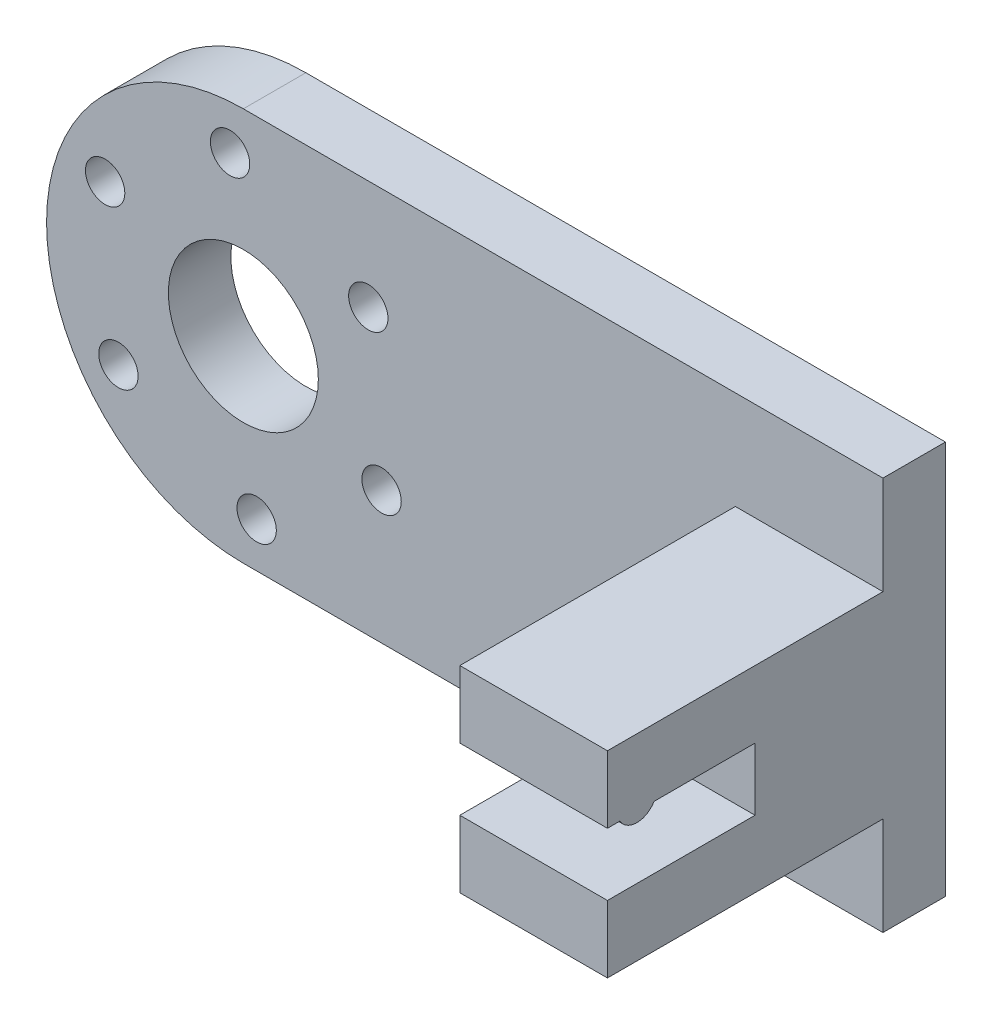
ISO-10303-21;
HEADER;
FILE_DESCRIPTION(('STEP AP214'),'2;1');
FILE_NAME('part.step','',(''),(''),'','','');
FILE_SCHEMA(('AUTOMOTIVE_DESIGN { 1 0 10303 214 1 1 1 1 }'));
ENDSEC;
DATA;
#1=APPLICATION_CONTEXT('core data for automotive mechanical design processes');
#2=APPLICATION_PROTOCOL_DEFINITION('international standard','automotive_design',2000,#1);
#3=PRODUCT_CONTEXT('',#1,'mechanical');
#4=PRODUCT('Part','Part','',(#3));
#5=PRODUCT_RELATED_PRODUCT_CATEGORY('part','',(#4));
#6=PRODUCT_DEFINITION_FORMATION('','',#4);
#7=PRODUCT_DEFINITION_CONTEXT('part definition',#1,'design');
#8=PRODUCT_DEFINITION('design','',#6,#7);
#9=PRODUCT_DEFINITION_SHAPE('','',#8);
#10=(LENGTH_UNIT() NAMED_UNIT(*) SI_UNIT(.MILLI.,.METRE.));
#11=(NAMED_UNIT(*) PLANE_ANGLE_UNIT() SI_UNIT($,.RADIAN.));
#12=(NAMED_UNIT(*) SI_UNIT($,.STERADIAN.) SOLID_ANGLE_UNIT());
#13=UNCERTAINTY_MEASURE_WITH_UNIT(LENGTH_MEASURE(1.E-05),#10,'distance_accuracy_value','');
#14=(GEOMETRIC_REPRESENTATION_CONTEXT(3) GLOBAL_UNCERTAINTY_ASSIGNED_CONTEXT((#13)) GLOBAL_UNIT_ASSIGNED_CONTEXT((#10,
#11,#12)) REPRESENTATION_CONTEXT('',''));
#15=CARTESIAN_POINT('',(0.,0.,0.));
#16=DIRECTION('',(0.,0.,1.));
#17=DIRECTION('',(1.,0.,0.));
#18=AXIS2_PLACEMENT_3D('',#15,#16,#17);
#19=CARTESIAN_POINT('',(-20.001,3.175,34.35));
#20=DIRECTION('',(0.,1.,0.));
#21=DIRECTION('',(0.,0.,1.));
#22=AXIS2_PLACEMENT_3D('',#19,#20,#21);
#23=PLANE('',#22);
#24=DIRECTION('',(0.,0.,-1.));
#25=VECTOR('',#24,1.);
#26=CARTESIAN_POINT('',(50.,3.175,34.35));
#27=LINE('',#26,#25);
#28=CARTESIAN_POINT('',(50.,3.175,34.35));
#29=VERTEX_POINT('',#28);
#30=CARTESIAN_POINT('',(50.,3.175,33.0820508075689));
#31=VERTEX_POINT('',#30);
#32=EDGE_CURVE('E175',#29,#31,#27,.T.);
#33=ORIENTED_EDGE('',*,*,#32,.T.);
#34=DIRECTION('',(1.,0.,0.));
#35=VECTOR('',#34,1.);
#36=CARTESIAN_POINT('',(44.3431457505076,3.175,33.0820508075689));
#37=LINE('',#36,#35);
#38=CARTESIAN_POINT('',(65.,3.175,33.0820508075689));
#39=VERTEX_POINT('',#38);
#40=EDGE_CURVE('E12',#31,#39,#37,.T.);
#41=ORIENTED_EDGE('',*,*,#40,.T.);
#42=DIRECTION('',(0.,0.,1.));
#43=VECTOR('',#42,1.);
#44=CARTESIAN_POINT('',(65.,3.175,34.35));
#45=LINE('',#44,#43);
#46=CARTESIAN_POINT('',(65.,3.175,34.35));
#47=VERTEX_POINT('',#46);
#48=EDGE_CURVE('E221',#39,#47,#45,.T.);
#49=ORIENTED_EDGE('',*,*,#48,.T.);
#50=DIRECTION('',(1.,0.,0.));
#51=VECTOR('',#50,1.);
#52=CARTESIAN_POINT('',(-20.001,3.175,34.35));
#53=LINE('',#52,#51);
#54=EDGE_CURVE('E224',#29,#47,#53,.T.);
#55=ORIENTED_EDGE('',*,*,#54,.F.);
#56=EDGE_LOOP('',(#33,#41,#49,#55));
#57=FACE_BOUND('',#56,.T.);
#58=ADVANCED_FACE('F54',(#57),#23,.F.);
#59=CARTESIAN_POINT('',(0.,0.,0.));
#60=DIRECTION('',(0.,0.,-1.));
#61=DIRECTION('',(-1.,0.,0.));
#62=AXIS2_PLACEMENT_3D('',#59,#60,#61);
#63=PLANE('',#62);
#64=CARTESIAN_POINT('',(45.72,0.,0.));
#65=DIRECTION('',(0.,0.,-1.));
#66=DIRECTION('',(-1.,0.,0.));
#67=AXIS2_PLACEMENT_3D('',#64,#65,#66);
#68=CIRCLE('',#67,3.05);
#69=CARTESIAN_POINT('',(47.3933200530682,2.55,0.));
#70=VERTEX_POINT('',#69);
#71=CARTESIAN_POINT('',(44.0466799469318,2.55,0.));
#72=VERTEX_POINT('',#71);
#73=EDGE_CURVE('E201',#70,#72,#68,.T.);
#74=ORIENTED_EDGE('',*,*,#73,.F.);
#75=DIRECTION('',(1.,0.,0.));
#76=VECTOR('',#75,1.);
#77=CARTESIAN_POINT('',(47.3933200530682,2.55,0.));
#78=LINE('',#77,#76);
#79=EDGE_CURVE('E203',#72,#70,#78,.T.);
#80=ORIENTED_EDGE('',*,*,#79,.F.);
#81=EDGE_LOOP('',(#74,#80));
#82=FACE_BOUND('',#81,.T.);
#83=CARTESIAN_POINT('',(45.72,0.,0.));
#84=DIRECTION('',(0.,0.,-1.));
#85=DIRECTION('',(-1.,0.,0.));
#86=AXIS2_PLACEMENT_3D('',#83,#84,#85);
#87=CIRCLE('',#86,13.5);
#88=CARTESIAN_POINT('',(32.22,0.,0.));
#89=VERTEX_POINT('',#88);
#90=EDGE_CURVE('E183',#89,#89,#87,.T.);
#91=ORIENTED_EDGE('',*,*,#90,.T.);
#92=EDGE_LOOP('',(#91));
#93=FACE_BOUND('',#92,.T.);
#94=ADVANCED_FACE('F378',(#82,#93),#63,.T.);
#95=CARTESIAN_POINT('',(65.,10.,34.35));
#96=DIRECTION('',(0.,0.,-1.));
#97=DIRECTION('',(-1.,0.,0.));
#98=AXIS2_PLACEMENT_3D('',#95,#96,#97);
#99=PLANE('',#98);
#100=DIRECTION('',(0.,-1.,0.));
#101=VECTOR('',#100,1.);
#102=CARTESIAN_POINT('',(50.,10.,34.35));
#103=LINE('',#102,#101);
#104=CARTESIAN_POINT('',(50.,10.,34.35));
#105=VERTEX_POINT('',#104);
#106=EDGE_CURVE('E260',#105,#29,#103,.T.);
#107=ORIENTED_EDGE('',*,*,#106,.T.);
#108=ORIENTED_EDGE('',*,*,#54,.T.);
#109=DIRECTION('',(0.,-1.,0.));
#110=VECTOR('',#109,1.);
#111=CARTESIAN_POINT('',(65.,10.,34.35));
#112=LINE('',#111,#110);
#113=CARTESIAN_POINT('',(65.,10.,34.35));
#114=VERTEX_POINT('',#113);
#115=EDGE_CURVE('E256',#114,#47,#112,.T.);
#116=ORIENTED_EDGE('',*,*,#115,.F.);
#117=DIRECTION('',(1.,0.,0.));
#118=VECTOR('',#117,1.);
#119=CARTESIAN_POINT('',(65.,10.,34.35));
#120=LINE('',#119,#118);
#121=EDGE_CURVE('E244',#105,#114,#120,.T.);
#122=ORIENTED_EDGE('',*,*,#121,.F.);
#123=EDGE_LOOP('',(#107,#108,#116,#122));
#124=FACE_BOUND('',#123,.T.);
#125=ADVANCED_FACE('F376',(#124),#99,.F.);
#126=CARTESIAN_POINT('',(65.,20.,6.35));
#127=DIRECTION('',(1.,0.,0.));
#128=DIRECTION('',(0.,0.,-1.));
#129=AXIS2_PLACEMENT_3D('',#126,#127,#128);
#130=PLANE('',#129);
#131=ORIENTED_EDGE('',*,*,#48,.F.);
#132=CARTESIAN_POINT('',(65.,4.175,31.35));
#133=DIRECTION('',(1.,0.,0.));
#134=DIRECTION('',(0.,0.,-1.));
#135=AXIS2_PLACEMENT_3D('',#132,#133,#134);
#136=CIRCLE('',#135,2.);
#137=CARTESIAN_POINT('',(65.,3.175,29.6179491924311));
#138=VERTEX_POINT('',#137);
#139=EDGE_CURVE('E184',#39,#138,#136,.T.);
#140=ORIENTED_EDGE('',*,*,#139,.T.);
#141=CARTESIAN_POINT('',(65.,3.175,19.35));
#142=VERTEX_POINT('',#141);
#143=EDGE_CURVE('E75',#142,#138,#45,.T.);
#144=ORIENTED_EDGE('',*,*,#143,.F.);
#145=DIRECTION('',(0.,1.,0.));
#146=VECTOR('',#145,1.);
#147=CARTESIAN_POINT('',(65.,3.175,19.35));
#148=LINE('',#147,#146);
#149=CARTESIAN_POINT('',(65.,-3.175,19.35));
#150=VERTEX_POINT('',#149);
#151=EDGE_CURVE('E218',#150,#142,#148,.T.);
#152=ORIENTED_EDGE('',*,*,#151,.F.);
#153=DIRECTION('',(0.,0.,-1.));
#154=VECTOR('',#153,1.);
#155=CARTESIAN_POINT('',(65.,-3.175,34.35));
#156=LINE('',#155,#154);
#157=CARTESIAN_POINT('',(65.,-3.175,34.35));
#158=VERTEX_POINT('',#157);
#159=EDGE_CURVE('E215',#158,#150,#156,.T.);
#160=ORIENTED_EDGE('',*,*,#159,.F.);
#161=CARTESIAN_POINT('',(65.,-10.,34.35));
#162=VERTEX_POINT('',#161);
#163=EDGE_CURVE('E246',#158,#162,#112,.T.);
#164=ORIENTED_EDGE('',*,*,#163,.T.);
#165=DIRECTION('',(0.,0.,-1.));
#166=VECTOR('',#165,1.);
#167=CARTESIAN_POINT('',(65.,-10.,6.35));
#168=LINE('',#167,#166);
#169=CARTESIAN_POINT('',(65.,-10.,6.35));
#170=VERTEX_POINT('',#169);
#171=EDGE_CURVE('E234',#162,#170,#168,.T.);
#172=ORIENTED_EDGE('',*,*,#171,.T.);
#173=DIRECTION('',(0.,-1.,0.));
#174=VECTOR('',#173,1.);
#175=CARTESIAN_POINT('',(65.,20.,6.35));
#176=LINE('',#175,#174);
#177=CARTESIAN_POINT('',(65.,-20.,6.35));
#178=VERTEX_POINT('',#177);
#179=EDGE_CURVE('E312',#170,#178,#176,.T.);
#180=ORIENTED_EDGE('',*,*,#179,.T.);
#181=DIRECTION('',(0.,0.,-1.));
#182=VECTOR('',#181,1.);
#183=CARTESIAN_POINT('',(65.,-20.,6.35));
#184=LINE('',#183,#182);
#185=CARTESIAN_POINT('',(65.,-20.,0.));
#186=VERTEX_POINT('',#185);
#187=EDGE_CURVE('E181',#178,#186,#184,.T.);
#188=ORIENTED_EDGE('',*,*,#187,.T.);
#189=DIRECTION('',(0.,-1.,0.));
#190=VECTOR('',#189,1.);
#191=CARTESIAN_POINT('',(65.,20.,0.));
#192=LINE('',#191,#190);
#193=CARTESIAN_POINT('',(65.,20.,0.));
#194=VERTEX_POINT('',#193);
#195=EDGE_CURVE('E324',#194,#186,#192,.T.);
#196=ORIENTED_EDGE('',*,*,#195,.F.);
#197=DIRECTION('',(0.,0.,-1.));
#198=VECTOR('',#197,1.);
#199=CARTESIAN_POINT('',(65.,20.,6.35));
#200=LINE('',#199,#198);
#201=CARTESIAN_POINT('',(65.,20.,6.35));
#202=VERTEX_POINT('',#201);
#203=EDGE_CURVE('E333',#202,#194,#200,.T.);
#204=ORIENTED_EDGE('',*,*,#203,.F.);
#205=CARTESIAN_POINT('',(65.,10.,6.35));
#206=VERTEX_POINT('',#205);
#207=EDGE_CURVE('E314',#202,#206,#176,.T.);
#208=ORIENTED_EDGE('',*,*,#207,.T.);
#209=DIRECTION('',(0.,0.,-1.));
#210=VECTOR('',#209,1.);
#211=CARTESIAN_POINT('',(65.,10.,6.35));
#212=LINE('',#211,#210);
#213=EDGE_CURVE('E235',#114,#206,#212,.T.);
#214=ORIENTED_EDGE('',*,*,#213,.F.);
#215=ORIENTED_EDGE('',*,*,#115,.T.);
#216=EDGE_LOOP('',(#131,#140,#144,#152,#160,#164,#172,#180,#188,#196,#204,#208,#214,#215));
#217=FACE_BOUND('',#216,.T.);
#218=ADVANCED_FACE('F359',(#217),#130,.T.);
#219=CARTESIAN_POINT('',(0.,20.,6.35));
#220=DIRECTION('',(0.,1.,0.));
#221=DIRECTION('',(0.,0.,1.));
#222=AXIS2_PLACEMENT_3D('',#219,#220,#221);
#223=PLANE('',#222);
#224=DIRECTION('',(1.,0.,0.));
#225=VECTOR('',#224,1.);
#226=CARTESIAN_POINT('',(0.,20.,0.));
#227=LINE('',#226,#225);
#228=CARTESIAN_POINT('',(0.,20.,0.));
#229=VERTEX_POINT('',#228);
#230=EDGE_CURVE('E313',#229,#194,#227,.T.);
#231=ORIENTED_EDGE('',*,*,#230,.F.);
#232=DIRECTION('',(0.,0.,-1.));
#233=VECTOR('',#232,1.);
#234=CARTESIAN_POINT('',(0.,20.,6.35));
#235=LINE('',#234,#233);
#236=CARTESIAN_POINT('',(0.,20.,6.35));
#237=VERTEX_POINT('',#236);
#238=EDGE_CURVE('E331',#237,#229,#235,.T.);
#239=ORIENTED_EDGE('',*,*,#238,.F.);
#240=DIRECTION('',(1.,0.,0.));
#241=VECTOR('',#240,1.);
#242=CARTESIAN_POINT('',(0.,20.,6.35));
#243=LINE('',#242,#241);
#244=EDGE_CURVE('E317',#237,#202,#243,.T.);
#245=ORIENTED_EDGE('',*,*,#244,.T.);
#246=ORIENTED_EDGE('',*,*,#203,.T.);
#247=EDGE_LOOP('',(#231,#239,#245,#246));
#248=FACE_BOUND('',#247,.T.);
#249=ADVANCED_FACE('F357',(#248),#223,.T.);
#250=CARTESIAN_POINT('',(0.,-20.,6.35));
#251=DIRECTION('',(0.,1.,0.));
#252=DIRECTION('',(0.,0.,1.));
#253=AXIS2_PLACEMENT_3D('',#250,#251,#252);
#254=PLANE('',#253);
#255=DIRECTION('',(1.,0.,0.));
#256=VECTOR('',#255,1.);
#257=CARTESIAN_POINT('',(0.,-20.,0.));
#258=LINE('',#257,#256);
#259=CARTESIAN_POINT('',(0.,-20.,0.));
#260=VERTEX_POINT('',#259);
#261=EDGE_CURVE('E321',#260,#186,#258,.T.);
#262=ORIENTED_EDGE('',*,*,#261,.T.);
#263=ORIENTED_EDGE('',*,*,#187,.F.);
#264=DIRECTION('',(1.,0.,0.));
#265=VECTOR('',#264,1.);
#266=CARTESIAN_POINT('',(0.,-20.,6.35));
#267=LINE('',#266,#265);
#268=CARTESIAN_POINT('',(0.,-20.,6.35));
#269=VERTEX_POINT('',#268);
#270=EDGE_CURVE('E309',#269,#178,#267,.T.);
#271=ORIENTED_EDGE('',*,*,#270,.F.);
#272=DIRECTION('',(0.,0.,-1.));
#273=VECTOR('',#272,1.);
#274=CARTESIAN_POINT('',(0.,-20.,6.35));
#275=LINE('',#274,#273);
#276=EDGE_CURVE('E320',#269,#260,#275,.T.);
#277=ORIENTED_EDGE('',*,*,#276,.T.);
#278=EDGE_LOOP('',(#262,#263,#271,#277));
#279=FACE_BOUND('',#278,.T.);
#280=ADVANCED_FACE('F349',(#279),#254,.F.);
#281=CARTESIAN_POINT('',(45.72,0.,0.));
#282=DIRECTION('',(0.,0.,-1.));
#283=DIRECTION('',(-1.,0.,0.));
#284=AXIS2_PLACEMENT_3D('',#281,#282,#283);
#285=CIRCLE('',#284,17.5);
#286=CARTESIAN_POINT('',(28.22,0.,0.));
#287=VERTEX_POINT('',#286);
#288=EDGE_CURVE('E192',#287,#287,#285,.T.);
#289=ORIENTED_EDGE('',*,*,#288,.F.);
#290=EDGE_LOOP('',(#289));
#291=FACE_BOUND('',#290,.T.);
#292=CARTESIAN_POINT('',(-14.0477706990681,6.55058305698084,0.));
#293=DIRECTION('',(0.,0.,1.));
#294=DIRECTION('',(1.,0.,0.));
#295=AXIS2_PLACEMENT_3D('',#292,#293,#294);
#296=CIRCLE('',#295,2.);
#297=CARTESIAN_POINT('',(-12.0477706990681,6.55058305698084,0.));
#298=VERTEX_POINT('',#297);
#299=EDGE_CURVE('E266',#298,#298,#296,.T.);
#300=ORIENTED_EDGE('',*,*,#299,.T.);
#301=EDGE_LOOP('',(#300));
#302=FACE_BOUND('',#301,.T.);
#303=CARTESIAN_POINT('',(-12.6968566864794,-8.89043476344122,0.));
#304=DIRECTION('',(0.,0.,1.));
#305=DIRECTION('',(1.,0.,0.));
#306=AXIS2_PLACEMENT_3D('',#303,#304,#305);
#307=CIRCLE('',#306,2.);
#308=CARTESIAN_POINT('',(-10.6968566864794,-8.89043476344122,0.));
#309=VERTEX_POINT('',#308);
#310=EDGE_CURVE('E295',#309,#309,#307,.T.);
#311=ORIENTED_EDGE('',*,*,#310,.T.);
#312=EDGE_LOOP('',(#311));
#313=FACE_BOUND('',#312,.T.);
#314=CARTESIAN_POINT('',(1.35091401258871,-15.4410178204221,0.));
#315=DIRECTION('',(0.,0.,1.));
#316=DIRECTION('',(1.,0.,0.));
#317=AXIS2_PLACEMENT_3D('',#314,#315,#316);
#318=CIRCLE('',#317,2.);
#319=CARTESIAN_POINT('',(3.35091401258871,-15.4410178204221,0.));
#320=VERTEX_POINT('',#319);
#321=EDGE_CURVE('E289',#320,#320,#318,.T.);
#322=ORIENTED_EDGE('',*,*,#321,.T.);
#323=EDGE_LOOP('',(#322));
#324=FACE_BOUND('',#323,.T.);
#325=CARTESIAN_POINT('',(14.0477706990681,-6.55058305698084,0.));
#326=DIRECTION('',(0.,0.,1.));
#327=DIRECTION('',(1.,0.,0.));
#328=AXIS2_PLACEMENT_3D('',#325,#326,#327);
#329=CIRCLE('',#328,2.);
#330=CARTESIAN_POINT('',(16.0477706990681,-6.55058305698084,0.));
#331=VERTEX_POINT('',#330);
#332=EDGE_CURVE('E283',#331,#331,#329,.T.);
#333=ORIENTED_EDGE('',*,*,#332,.T.);
#334=EDGE_LOOP('',(#333));
#335=FACE_BOUND('',#334,.T.);
#336=CARTESIAN_POINT('',(12.6968566864794,8.89043476344122,0.));
#337=DIRECTION('',(0.,0.,1.));
#338=DIRECTION('',(1.,0.,0.));
#339=AXIS2_PLACEMENT_3D('',#336,#337,#338);
#340=CIRCLE('',#339,2.);
#341=CARTESIAN_POINT('',(14.6968566864794,8.89043476344122,0.));
#342=VERTEX_POINT('',#341);
#343=EDGE_CURVE('E277',#342,#342,#340,.T.);
#344=ORIENTED_EDGE('',*,*,#343,.T.);
#345=EDGE_LOOP('',(#344));
#346=FACE_BOUND('',#345,.T.);
#347=CARTESIAN_POINT('',(-1.3509140125887,15.4410178204221,0.));
#348=DIRECTION('',(0.,0.,1.));
#349=DIRECTION('',(1.,0.,0.));
#350=AXIS2_PLACEMENT_3D('',#347,#348,#349);
#351=CIRCLE('',#350,2.);
#352=CARTESIAN_POINT('',(0.649085987411296,15.4410178204221,0.));
#353=VERTEX_POINT('',#352);
#354=EDGE_CURVE('E271',#353,#353,#351,.T.);
#355=ORIENTED_EDGE('',*,*,#354,.T.);
#356=EDGE_LOOP('',(#355));
#357=FACE_BOUND('',#356,.T.);
#358=CARTESIAN_POINT('',(0.,0.,0.));
#359=DIRECTION('',(0.,0.,1.));
#360=DIRECTION('',(1.,0.,0.));
#361=AXIS2_PLACEMENT_3D('',#358,#359,#360);
#362=CIRCLE('',#361,7.62);
#363=CARTESIAN_POINT('',(7.62,0.,0.));
#364=VERTEX_POINT('',#363);
#365=EDGE_CURVE('E303',#364,#364,#362,.T.);
#366=ORIENTED_EDGE('',*,*,#365,.T.);
#367=EDGE_LOOP('',(#366));
#368=FACE_BOUND('',#367,.T.);
#369=ORIENTED_EDGE('',*,*,#261,.F.);
#370=CARTESIAN_POINT('',(0.,0.,0.));
#371=DIRECTION('',(0.,0.,1.));
#372=DIRECTION('',(1.,0.,0.));
#373=AXIS2_PLACEMENT_3D('',#370,#371,#372);
#374=CIRCLE('',#373,20.);
#375=EDGE_CURVE('E306',#229,#260,#374,.T.);
#376=ORIENTED_EDGE('',*,*,#375,.F.);
#377=ORIENTED_EDGE('',*,*,#230,.T.);
#378=ORIENTED_EDGE('',*,*,#195,.T.);
#379=EDGE_LOOP('',(#369,#376,#377,#378));
#380=FACE_BOUND('',#379,.T.);
#381=ADVANCED_FACE('F345',(#291,#302,#313,#324,#335,#346,#357,#368,#380),#63,.T.);
#382=CARTESIAN_POINT('',(0.,0.,6.35));
#383=DIRECTION('',(0.,0.,-1.));
#384=DIRECTION('',(-1.,0.,0.));
#385=AXIS2_PLACEMENT_3D('',#382,#383,#384);
#386=PLANE('',#385);
#387=DIRECTION('',(-1.,0.,0.));
#388=VECTOR('',#387,1.);
#389=CARTESIAN_POINT('',(47.3933200530682,2.55,6.35));
#390=LINE('',#389,#388);
#391=CARTESIAN_POINT('',(47.3933200530682,2.55,6.35));
#392=VERTEX_POINT('',#391);
#393=CARTESIAN_POINT('',(44.0466799469318,2.55,6.35));
#394=VERTEX_POINT('',#393);
#395=EDGE_CURVE('E209',#392,#394,#390,.T.);
#396=ORIENTED_EDGE('',*,*,#395,.F.);
#397=CARTESIAN_POINT('',(45.72,0.,6.35));
#398=DIRECTION('',(0.,0.,-1.));
#399=DIRECTION('',(-1.,0.,0.));
#400=AXIS2_PLACEMENT_3D('',#397,#398,#399);
#401=CIRCLE('',#400,3.05);
#402=EDGE_CURVE('E197',#394,#392,#401,.F.);
#403=ORIENTED_EDGE('',*,*,#402,.F.);
#404=EDGE_LOOP('',(#396,#403));
#405=FACE_BOUND('',#404,.T.);
#406=CARTESIAN_POINT('',(-14.0477706990681,6.55058305698084,6.35));
#407=DIRECTION('',(0.,0.,1.));
#408=DIRECTION('',(1.,0.,0.));
#409=AXIS2_PLACEMENT_3D('',#406,#407,#408);
#410=CIRCLE('',#409,2.);
#411=CARTESIAN_POINT('',(-12.0477706990681,6.55058305698084,6.35));
#412=VERTEX_POINT('',#411);
#413=EDGE_CURVE('E298',#412,#412,#410,.T.);
#414=ORIENTED_EDGE('',*,*,#413,.F.);
#415=EDGE_LOOP('',(#414));
#416=FACE_BOUND('',#415,.T.);
#417=CARTESIAN_POINT('',(-12.6968566864794,-8.89043476344122,6.35));
#418=DIRECTION('',(0.,0.,1.));
#419=DIRECTION('',(1.,0.,0.));
#420=AXIS2_PLACEMENT_3D('',#417,#418,#419);
#421=CIRCLE('',#420,2.);
#422=CARTESIAN_POINT('',(-10.6968566864794,-8.89043476344122,6.35));
#423=VERTEX_POINT('',#422);
#424=EDGE_CURVE('E292',#423,#423,#421,.T.);
#425=ORIENTED_EDGE('',*,*,#424,.F.);
#426=EDGE_LOOP('',(#425));
#427=FACE_BOUND('',#426,.T.);
#428=CARTESIAN_POINT('',(1.35091401258871,-15.4410178204221,6.35));
#429=DIRECTION('',(0.,0.,1.));
#430=DIRECTION('',(1.,0.,0.));
#431=AXIS2_PLACEMENT_3D('',#428,#429,#430);
#432=CIRCLE('',#431,2.);
#433=CARTESIAN_POINT('',(3.35091401258871,-15.4410178204221,6.35));
#434=VERTEX_POINT('',#433);
#435=EDGE_CURVE('E286',#434,#434,#432,.T.);
#436=ORIENTED_EDGE('',*,*,#435,.F.);
#437=EDGE_LOOP('',(#436));
#438=FACE_BOUND('',#437,.T.);
#439=CARTESIAN_POINT('',(14.0477706990681,-6.55058305698084,6.35));
#440=DIRECTION('',(0.,0.,1.));
#441=DIRECTION('',(1.,0.,0.));
#442=AXIS2_PLACEMENT_3D('',#439,#440,#441);
#443=CIRCLE('',#442,2.);
#444=CARTESIAN_POINT('',(16.0477706990681,-6.55058305698084,6.35));
#445=VERTEX_POINT('',#444);
#446=EDGE_CURVE('E280',#445,#445,#443,.T.);
#447=ORIENTED_EDGE('',*,*,#446,.F.);
#448=EDGE_LOOP('',(#447));
#449=FACE_BOUND('',#448,.T.);
#450=CARTESIAN_POINT('',(12.6968566864794,8.89043476344122,6.35));
#451=DIRECTION('',(0.,0.,1.));
#452=DIRECTION('',(1.,0.,0.));
#453=AXIS2_PLACEMENT_3D('',#450,#451,#452);
#454=CIRCLE('',#453,2.);
#455=CARTESIAN_POINT('',(14.6968566864794,8.89043476344122,6.35));
#456=VERTEX_POINT('',#455);
#457=EDGE_CURVE('E274',#456,#456,#454,.T.);
#458=ORIENTED_EDGE('',*,*,#457,.F.);
#459=EDGE_LOOP('',(#458));
#460=FACE_BOUND('',#459,.T.);
#461=CARTESIAN_POINT('',(-1.3509140125887,15.4410178204221,6.35));
#462=DIRECTION('',(0.,0.,1.));
#463=DIRECTION('',(1.,0.,0.));
#464=AXIS2_PLACEMENT_3D('',#461,#462,#463);
#465=CIRCLE('',#464,2.);
#466=CARTESIAN_POINT('',(0.649085987411296,15.4410178204221,6.35));
#467=VERTEX_POINT('',#466);
#468=EDGE_CURVE('E267',#467,#467,#465,.T.);
#469=ORIENTED_EDGE('',*,*,#468,.F.);
#470=EDGE_LOOP('',(#469));
#471=FACE_BOUND('',#470,.T.);
#472=CARTESIAN_POINT('',(0.,0.,6.35));
#473=DIRECTION('',(0.,0.,1.));
#474=DIRECTION('',(1.,0.,0.));
#475=AXIS2_PLACEMENT_3D('',#472,#473,#474);
#476=CIRCLE('',#475,7.62);
#477=CARTESIAN_POINT('',(7.62,0.,6.35));
#478=VERTEX_POINT('',#477);
#479=EDGE_CURVE('E270',#478,#478,#476,.T.);
#480=ORIENTED_EDGE('',*,*,#479,.F.);
#481=EDGE_LOOP('',(#480));
#482=FACE_BOUND('',#481,.T.);
#483=ORIENTED_EDGE('',*,*,#179,.F.);
#484=DIRECTION('',(-1.,0.,0.));
#485=VECTOR('',#484,1.);
#486=CARTESIAN_POINT('',(65.,-10.,6.35));
#487=LINE('',#486,#485);
#488=CARTESIAN_POINT('',(50.,-10.,6.35));
#489=VERTEX_POINT('',#488);
#490=EDGE_CURVE('E249',#170,#489,#487,.T.);
#491=ORIENTED_EDGE('',*,*,#490,.T.);
#492=DIRECTION('',(0.,-1.,0.));
#493=VECTOR('',#492,1.);
#494=CARTESIAN_POINT('',(50.,10.,6.35));
#495=LINE('',#494,#493);
#496=CARTESIAN_POINT('',(50.,10.,6.35));
#497=VERTEX_POINT('',#496);
#498=EDGE_CURVE('E263',#497,#489,#495,.T.);
#499=ORIENTED_EDGE('',*,*,#498,.F.);
#500=DIRECTION('',(-1.,0.,0.));
#501=VECTOR('',#500,1.);
#502=CARTESIAN_POINT('',(65.,10.,6.35));
#503=LINE('',#502,#501);
#504=EDGE_CURVE('E238',#206,#497,#503,.T.);
#505=ORIENTED_EDGE('',*,*,#504,.F.);
#506=ORIENTED_EDGE('',*,*,#207,.F.);
#507=ORIENTED_EDGE('',*,*,#244,.F.);
#508=CARTESIAN_POINT('',(0.,0.,6.35));
#509=DIRECTION('',(0.,0.,1.));
#510=DIRECTION('',(1.,0.,0.));
#511=AXIS2_PLACEMENT_3D('',#508,#509,#510);
#512=CIRCLE('',#511,20.);
#513=EDGE_CURVE('E325',#237,#269,#512,.T.);
#514=ORIENTED_EDGE('',*,*,#513,.T.);
#515=ORIENTED_EDGE('',*,*,#270,.T.);
#516=EDGE_LOOP('',(#483,#491,#499,#505,#506,#507,#514,#515));
#517=FACE_BOUND('',#516,.T.);
#518=ADVANCED_FACE('F352',(#405,#416,#427,#438,#449,#460,#471,#482,#517),#386,.F.);
#519=CARTESIAN_POINT('',(0.,0.,6.35));
#520=DIRECTION('',(0.,0.,-1.));
#521=DIRECTION('',(-1.,0.,0.));
#522=AXIS2_PLACEMENT_3D('',#519,#520,#521);
#523=CYLINDRICAL_SURFACE('',#522,20.);
#524=ORIENTED_EDGE('',*,*,#375,.T.);
#525=ORIENTED_EDGE('',*,*,#276,.F.);
#526=ORIENTED_EDGE('',*,*,#513,.F.);
#527=ORIENTED_EDGE('',*,*,#238,.T.);
#528=EDGE_LOOP('',(#524,#525,#526,#527));
#529=FACE_BOUND('',#528,.T.);
#530=ADVANCED_FACE('F56',(#529),#523,.T.);
#531=CARTESIAN_POINT('',(0.,0.,0.));
#532=DIRECTION('',(0.,0.,1.));
#533=DIRECTION('',(1.,0.,0.));
#534=AXIS2_PLACEMENT_3D('',#531,#532,#533);
#535=CYLINDRICAL_SURFACE('',#534,7.62);
#536=ORIENTED_EDGE('',*,*,#365,.F.);
#537=EDGE_LOOP('',(#536));
#538=FACE_BOUND('',#537,.T.);
#539=ORIENTED_EDGE('',*,*,#479,.T.);
#540=EDGE_LOOP('',(#539));
#541=FACE_BOUND('',#540,.T.);
#542=ADVANCED_FACE('F417',(#538,#541),#535,.F.);
#543=CARTESIAN_POINT('',(-1.3509140125887,15.4410178204221,0.));
#544=DIRECTION('',(0.,0.,1.));
#545=DIRECTION('',(1.,0.,0.));
#546=AXIS2_PLACEMENT_3D('',#543,#544,#545);
#547=CYLINDRICAL_SURFACE('',#546,2.);
#548=ORIENTED_EDGE('',*,*,#354,.F.);
#549=EDGE_LOOP('',(#548));
#550=FACE_BOUND('',#549,.T.);
#551=ORIENTED_EDGE('',*,*,#468,.T.);
#552=EDGE_LOOP('',(#551));
#553=FACE_BOUND('',#552,.T.);
#554=ADVANCED_FACE('F413',(#550,#553),#547,.F.);
#555=CARTESIAN_POINT('',(12.6968566864794,8.89043476344122,0.));
#556=DIRECTION('',(0.,0.,1.));
#557=DIRECTION('',(1.,0.,0.));
#558=AXIS2_PLACEMENT_3D('',#555,#556,#557);
#559=CYLINDRICAL_SURFACE('',#558,2.);
#560=ORIENTED_EDGE('',*,*,#343,.F.);
#561=EDGE_LOOP('',(#560));
#562=FACE_BOUND('',#561,.T.);
#563=ORIENTED_EDGE('',*,*,#457,.T.);
#564=EDGE_LOOP('',(#563));
#565=FACE_BOUND('',#564,.T.);
#566=ADVANCED_FACE('F416',(#562,#565),#559,.F.);
#567=CARTESIAN_POINT('',(14.0477706990681,-6.55058305698084,0.));
#568=DIRECTION('',(0.,0.,1.));
#569=DIRECTION('',(1.,0.,0.));
#570=AXIS2_PLACEMENT_3D('',#567,#568,#569);
#571=CYLINDRICAL_SURFACE('',#570,2.);
#572=ORIENTED_EDGE('',*,*,#332,.F.);
#573=EDGE_LOOP('',(#572));
#574=FACE_BOUND('',#573,.T.);
#575=ORIENTED_EDGE('',*,*,#446,.T.);
#576=EDGE_LOOP('',(#575));
#577=FACE_BOUND('',#576,.T.);
#578=ADVANCED_FACE('F421',(#574,#577),#571,.F.);
#579=CARTESIAN_POINT('',(1.35091401258871,-15.4410178204221,0.));
#580=DIRECTION('',(0.,0.,1.));
#581=DIRECTION('',(1.,0.,0.));
#582=AXIS2_PLACEMENT_3D('',#579,#580,#581);
#583=CYLINDRICAL_SURFACE('',#582,2.);
#584=ORIENTED_EDGE('',*,*,#321,.F.);
#585=EDGE_LOOP('',(#584));
#586=FACE_BOUND('',#585,.T.);
#587=ORIENTED_EDGE('',*,*,#435,.T.);
#588=EDGE_LOOP('',(#587));
#589=FACE_BOUND('',#588,.T.);
#590=ADVANCED_FACE('F425',(#586,#589),#583,.F.);
#591=CARTESIAN_POINT('',(-12.6968566864794,-8.89043476344122,0.));
#592=DIRECTION('',(0.,0.,1.));
#593=DIRECTION('',(1.,0.,0.));
#594=AXIS2_PLACEMENT_3D('',#591,#592,#593);
#595=CYLINDRICAL_SURFACE('',#594,2.);
#596=ORIENTED_EDGE('',*,*,#310,.F.);
#597=EDGE_LOOP('',(#596));
#598=FACE_BOUND('',#597,.T.);
#599=ORIENTED_EDGE('',*,*,#424,.T.);
#600=EDGE_LOOP('',(#599));
#601=FACE_BOUND('',#600,.T.);
#602=ADVANCED_FACE('F429',(#598,#601),#595,.F.);
#603=CARTESIAN_POINT('',(-14.0477706990681,6.55058305698084,0.));
#604=DIRECTION('',(0.,0.,1.));
#605=DIRECTION('',(1.,0.,0.));
#606=AXIS2_PLACEMENT_3D('',#603,#604,#605);
#607=CYLINDRICAL_SURFACE('',#606,2.);
#608=ORIENTED_EDGE('',*,*,#299,.F.);
#609=EDGE_LOOP('',(#608));
#610=FACE_BOUND('',#609,.T.);
#611=ORIENTED_EDGE('',*,*,#413,.T.);
#612=EDGE_LOOP('',(#611));
#613=FACE_BOUND('',#612,.T.);
#614=ADVANCED_FACE('F412',(#610,#613),#607,.F.);
#615=CARTESIAN_POINT('',(50.,10.,6.35));
#616=DIRECTION('',(1.,0.,0.));
#617=DIRECTION('',(0.,0.,-1.));
#618=AXIS2_PLACEMENT_3D('',#615,#616,#617);
#619=PLANE('',#618);
#620=CARTESIAN_POINT('',(50.,3.175,29.6179491924311));
#621=VERTEX_POINT('',#620);
#622=CARTESIAN_POINT('',(50.,3.175,19.35));
#623=VERTEX_POINT('',#622);
#624=EDGE_CURVE('E166',#621,#623,#27,.T.);
#625=ORIENTED_EDGE('',*,*,#624,.F.);
#626=CARTESIAN_POINT('',(50.,4.175,31.35));
#627=DIRECTION('',(1.,0.,0.));
#628=DIRECTION('',(0.,0.,-1.));
#629=AXIS2_PLACEMENT_3D('',#626,#627,#628);
#630=CIRCLE('',#629,2.);
#631=EDGE_CURVE('E170',#621,#31,#630,.F.);
#632=ORIENTED_EDGE('',*,*,#631,.T.);
#633=ORIENTED_EDGE('',*,*,#32,.F.);
#634=ORIENTED_EDGE('',*,*,#106,.F.);
#635=DIRECTION('',(0.,0.,1.));
#636=VECTOR('',#635,1.);
#637=CARTESIAN_POINT('',(50.,10.,6.35));
#638=LINE('',#637,#636);
#639=EDGE_CURVE('E242',#497,#105,#638,.T.);
#640=ORIENTED_EDGE('',*,*,#639,.F.);
#641=ORIENTED_EDGE('',*,*,#498,.T.);
#642=DIRECTION('',(0.,0.,1.));
#643=VECTOR('',#642,1.);
#644=CARTESIAN_POINT('',(50.,-10.,6.35));
#645=LINE('',#644,#643);
#646=CARTESIAN_POINT('',(50.,-10.,34.35));
#647=VERTEX_POINT('',#646);
#648=EDGE_CURVE('E251',#489,#647,#645,.T.);
#649=ORIENTED_EDGE('',*,*,#648,.T.);
#650=CARTESIAN_POINT('',(50.,-3.175,34.35));
#651=VERTEX_POINT('',#650);
#652=EDGE_CURVE('E259',#651,#647,#103,.T.);
#653=ORIENTED_EDGE('',*,*,#652,.F.);
#654=DIRECTION('',(0.,0.,1.));
#655=VECTOR('',#654,1.);
#656=CARTESIAN_POINT('',(50.,-3.175,34.35));
#657=LINE('',#656,#655);
#658=CARTESIAN_POINT('',(50.,-3.175,19.35));
#659=VERTEX_POINT('',#658);
#660=EDGE_CURVE('E227',#659,#651,#657,.T.);
#661=ORIENTED_EDGE('',*,*,#660,.F.);
#662=DIRECTION('',(0.,-1.,0.));
#663=VECTOR('',#662,1.);
#664=CARTESIAN_POINT('',(50.,3.175,19.35));
#665=LINE('',#664,#663);
#666=EDGE_CURVE('E173',#623,#659,#665,.T.);
#667=ORIENTED_EDGE('',*,*,#666,.F.);
#668=EDGE_LOOP('',(#625,#632,#633,#634,#640,#641,#649,#653,#661,#667));
#669=FACE_BOUND('',#668,.T.);
#670=ADVANCED_FACE('F167',(#669),#619,.F.);
#671=ORIENTED_EDGE('',*,*,#163,.F.);
#672=DIRECTION('',(1.,0.,0.));
#673=VECTOR('',#672,1.);
#674=CARTESIAN_POINT('',(-20.001,-3.175,34.35));
#675=LINE('',#674,#673);
#676=EDGE_CURVE('E223',#651,#158,#675,.T.);
#677=ORIENTED_EDGE('',*,*,#676,.F.);
#678=ORIENTED_EDGE('',*,*,#652,.T.);
#679=DIRECTION('',(1.,0.,0.));
#680=VECTOR('',#679,1.);
#681=CARTESIAN_POINT('',(65.,-10.,34.35));
#682=LINE('',#681,#680);
#683=EDGE_CURVE('E239',#647,#162,#682,.T.);
#684=ORIENTED_EDGE('',*,*,#683,.T.);
#685=EDGE_LOOP('',(#671,#677,#678,#684));
#686=FACE_BOUND('',#685,.T.);
#687=ADVANCED_FACE('F404',(#686),#99,.F.);
#688=CARTESIAN_POINT('',(0.,10.,0.));
#689=DIRECTION('',(0.,-1.,0.));
#690=DIRECTION('',(0.,0.,-1.));
#691=AXIS2_PLACEMENT_3D('',#688,#689,#690);
#692=PLANE('',#691);
#693=ORIENTED_EDGE('',*,*,#213,.T.);
#694=ORIENTED_EDGE('',*,*,#504,.T.);
#695=ORIENTED_EDGE('',*,*,#639,.T.);
#696=ORIENTED_EDGE('',*,*,#121,.T.);
#697=EDGE_LOOP('',(#693,#694,#695,#696));
#698=FACE_BOUND('',#697,.T.);
#699=ADVANCED_FACE('F372',(#698),#692,.F.);
#700=CARTESIAN_POINT('',(0.,-10.,0.));
#701=DIRECTION('',(0.,-1.,0.));
#702=DIRECTION('',(0.,0.,-1.));
#703=AXIS2_PLACEMENT_3D('',#700,#701,#702);
#704=PLANE('',#703);
#705=ORIENTED_EDGE('',*,*,#171,.F.);
#706=ORIENTED_EDGE('',*,*,#683,.F.);
#707=ORIENTED_EDGE('',*,*,#648,.F.);
#708=ORIENTED_EDGE('',*,*,#490,.F.);
#709=EDGE_LOOP('',(#705,#706,#707,#708));
#710=FACE_BOUND('',#709,.T.);
#711=ADVANCED_FACE('F365',(#710),#704,.T.);
#712=ORIENTED_EDGE('',*,*,#143,.T.);
#713=DIRECTION('',(1.,0.,0.));
#714=VECTOR('',#713,1.);
#715=CARTESIAN_POINT('',(44.3431457505076,3.175,29.6179491924311));
#716=LINE('',#715,#714);
#717=EDGE_CURVE('E62',#138,#621,#716,.F.);
#718=ORIENTED_EDGE('',*,*,#717,.T.);
#719=ORIENTED_EDGE('',*,*,#624,.T.);
#720=DIRECTION('',(1.,0.,0.));
#721=VECTOR('',#720,1.);
#722=CARTESIAN_POINT('',(-20.001,3.175,19.35));
#723=LINE('',#722,#721);
#724=EDGE_CURVE('E228',#623,#142,#723,.T.);
#725=ORIENTED_EDGE('',*,*,#724,.T.);
#726=EDGE_LOOP('',(#712,#718,#719,#725));
#727=FACE_BOUND('',#726,.T.);
#728=ADVANCED_FACE('F177',(#727),#23,.F.);
#729=CARTESIAN_POINT('',(-20.001,3.175,19.35));
#730=DIRECTION('',(0.,0.,-1.));
#731=DIRECTION('',(-1.,0.,0.));
#732=AXIS2_PLACEMENT_3D('',#729,#730,#731);
#733=PLANE('',#732);
#734=ORIENTED_EDGE('',*,*,#666,.T.);
#735=DIRECTION('',(1.,0.,0.));
#736=VECTOR('',#735,1.);
#737=CARTESIAN_POINT('',(-20.001,-3.175,19.35));
#738=LINE('',#737,#736);
#739=EDGE_CURVE('E230',#659,#150,#738,.T.);
#740=ORIENTED_EDGE('',*,*,#739,.T.);
#741=ORIENTED_EDGE('',*,*,#151,.T.);
#742=ORIENTED_EDGE('',*,*,#724,.F.);
#743=EDGE_LOOP('',(#734,#740,#741,#742));
#744=FACE_BOUND('',#743,.T.);
#745=ADVANCED_FACE('F390',(#744),#733,.F.);
#746=CARTESIAN_POINT('',(-20.001,-3.175,34.35));
#747=DIRECTION('',(0.,-1.,0.));
#748=DIRECTION('',(0.,0.,-1.));
#749=AXIS2_PLACEMENT_3D('',#746,#747,#748);
#750=PLANE('',#749);
#751=ORIENTED_EDGE('',*,*,#660,.T.);
#752=ORIENTED_EDGE('',*,*,#676,.T.);
#753=ORIENTED_EDGE('',*,*,#159,.T.);
#754=ORIENTED_EDGE('',*,*,#739,.F.);
#755=EDGE_LOOP('',(#751,#752,#753,#754));
#756=FACE_BOUND('',#755,.T.);
#757=ADVANCED_FACE('F396',(#756),#750,.F.);
#758=CARTESIAN_POINT('',(45.72,0.,34.351));
#759=DIRECTION('',(0.,0.,-1.));
#760=DIRECTION('',(-1.,0.,0.));
#761=AXIS2_PLACEMENT_3D('',#758,#759,#760);
#762=CYLINDRICAL_SURFACE('',#761,3.05);
#763=ORIENTED_EDGE('',*,*,#402,.T.);
#764=DIRECTION('',(0.,0.,-1.));
#765=VECTOR('',#764,1.);
#766=CARTESIAN_POINT('',(47.3933200530682,2.55,34.351));
#767=LINE('',#766,#765);
#768=EDGE_CURVE('E207',#392,#70,#767,.T.);
#769=ORIENTED_EDGE('',*,*,#768,.T.);
#770=ORIENTED_EDGE('',*,*,#73,.T.);
#771=DIRECTION('',(0.,0.,-1.));
#772=VECTOR('',#771,1.);
#773=CARTESIAN_POINT('',(44.0466799469318,2.55,34.351));
#774=LINE('',#773,#772);
#775=EDGE_CURVE('E206',#394,#72,#774,.T.);
#776=ORIENTED_EDGE('',*,*,#775,.F.);
#777=EDGE_LOOP('',(#763,#769,#770,#776));
#778=FACE_BOUND('',#777,.T.);
#779=ADVANCED_FACE('F535',(#778),#762,.F.);
#780=CARTESIAN_POINT('',(47.3933200530682,2.55,34.351));
#781=DIRECTION('',(0.,1.,0.));
#782=DIRECTION('',(0.,0.,1.));
#783=AXIS2_PLACEMENT_3D('',#780,#781,#782);
#784=PLANE('',#783);
#785=ORIENTED_EDGE('',*,*,#395,.T.);
#786=ORIENTED_EDGE('',*,*,#775,.T.);
#787=ORIENTED_EDGE('',*,*,#79,.T.);
#788=ORIENTED_EDGE('',*,*,#768,.F.);
#789=EDGE_LOOP('',(#785,#786,#787,#788));
#790=FACE_BOUND('',#789,.T.);
#791=ADVANCED_FACE('F544',(#790),#784,.F.);
#792=CARTESIAN_POINT('',(45.72,0.,2.));
#793=DIRECTION('',(0.,0.,-1.));
#794=DIRECTION('',(-1.,0.,0.));
#795=AXIS2_PLACEMENT_3D('',#792,#793,#794);
#796=CYLINDRICAL_SURFACE('',#795,17.5);
#797=CARTESIAN_POINT('',(45.72,0.,2.));
#798=DIRECTION('',(0.,0.,-1.));
#799=DIRECTION('',(-1.,0.,0.));
#800=AXIS2_PLACEMENT_3D('',#797,#798,#799);
#801=CIRCLE('',#800,17.5);
#802=CARTESIAN_POINT('',(28.22,0.,2.));
#803=VERTEX_POINT('',#802);
#804=EDGE_CURVE('E194',#803,#803,#801,.T.);
#805=ORIENTED_EDGE('',*,*,#804,.F.);
#806=EDGE_LOOP('',(#805));
#807=FACE_BOUND('',#806,.T.);
#808=ORIENTED_EDGE('',*,*,#288,.T.);
#809=EDGE_LOOP('',(#808));
#810=FACE_BOUND('',#809,.T.);
#811=ADVANCED_FACE('F553',(#807,#810),#796,.F.);
#812=CARTESIAN_POINT('',(45.72,0.,2.));
#813=DIRECTION('',(0.,0.,-1.));
#814=DIRECTION('',(-1.,0.,0.));
#815=AXIS2_PLACEMENT_3D('',#812,#813,#814);
#816=PLANE('',#815);
#817=CARTESIAN_POINT('',(45.72,0.,2.));
#818=DIRECTION('',(0.,0.,-1.));
#819=DIRECTION('',(-1.,0.,0.));
#820=AXIS2_PLACEMENT_3D('',#817,#818,#819);
#821=CIRCLE('',#820,13.5);
#822=CARTESIAN_POINT('',(32.22,0.,2.));
#823=VERTEX_POINT('',#822);
#824=EDGE_CURVE('E187',#823,#823,#821,.T.);
#825=ORIENTED_EDGE('',*,*,#824,.F.);
#826=EDGE_LOOP('',(#825));
#827=FACE_BOUND('',#826,.T.);
#828=ORIENTED_EDGE('',*,*,#804,.T.);
#829=EDGE_LOOP('',(#828));
#830=FACE_BOUND('',#829,.T.);
#831=ADVANCED_FACE('F568',(#827,#830),#816,.T.);
#832=CARTESIAN_POINT('',(45.72,0.,2.));
#833=DIRECTION('',(0.,0.,-1.));
#834=DIRECTION('',(-1.,0.,0.));
#835=AXIS2_PLACEMENT_3D('',#832,#833,#834);
#836=CYLINDRICAL_SURFACE('',#835,13.5);
#837=ORIENTED_EDGE('',*,*,#824,.T.);
#838=EDGE_LOOP('',(#837));
#839=FACE_BOUND('',#838,.T.);
#840=ORIENTED_EDGE('',*,*,#90,.F.);
#841=EDGE_LOOP('',(#840));
#842=FACE_BOUND('',#841,.T.);
#843=ADVANCED_FACE('F578',(#839,#842),#836,.T.);
#844=CARTESIAN_POINT('',(44.3431457505076,4.175,31.35));
#845=DIRECTION('',(1.,0.,0.));
#846=DIRECTION('',(0.,0.,-1.));
#847=AXIS2_PLACEMENT_3D('',#844,#845,#846);
#848=CYLINDRICAL_SURFACE('',#847,2.);
#849=ORIENTED_EDGE('',*,*,#40,.F.);
#850=ORIENTED_EDGE('',*,*,#631,.F.);
#851=ORIENTED_EDGE('',*,*,#717,.F.);
#852=ORIENTED_EDGE('',*,*,#139,.F.);
#853=EDGE_LOOP('',(#849,#850,#851,#852));
#854=FACE_BOUND('',#853,.T.);
#855=ADVANCED_FACE('F182',(#854),#848,.T.);
#856=CLOSED_SHELL('',(#58,#94,#125,#218,#249,#280,#381,#518,#530,#542,#554,#566,#578,#590,#602,
#614,#670,#687,#699,#711,#728,#745,#757,#779,#791,#811,#831,#843,#855));
#857=MANIFOLD_SOLID_BREP('B2',#856);
#858=ADVANCED_BREP_SHAPE_REPRESENTATION('',(#18,#857),#14);
#859=SHAPE_DEFINITION_REPRESENTATION(#9,#858);
ENDSEC;
END-ISO-10303-21;
